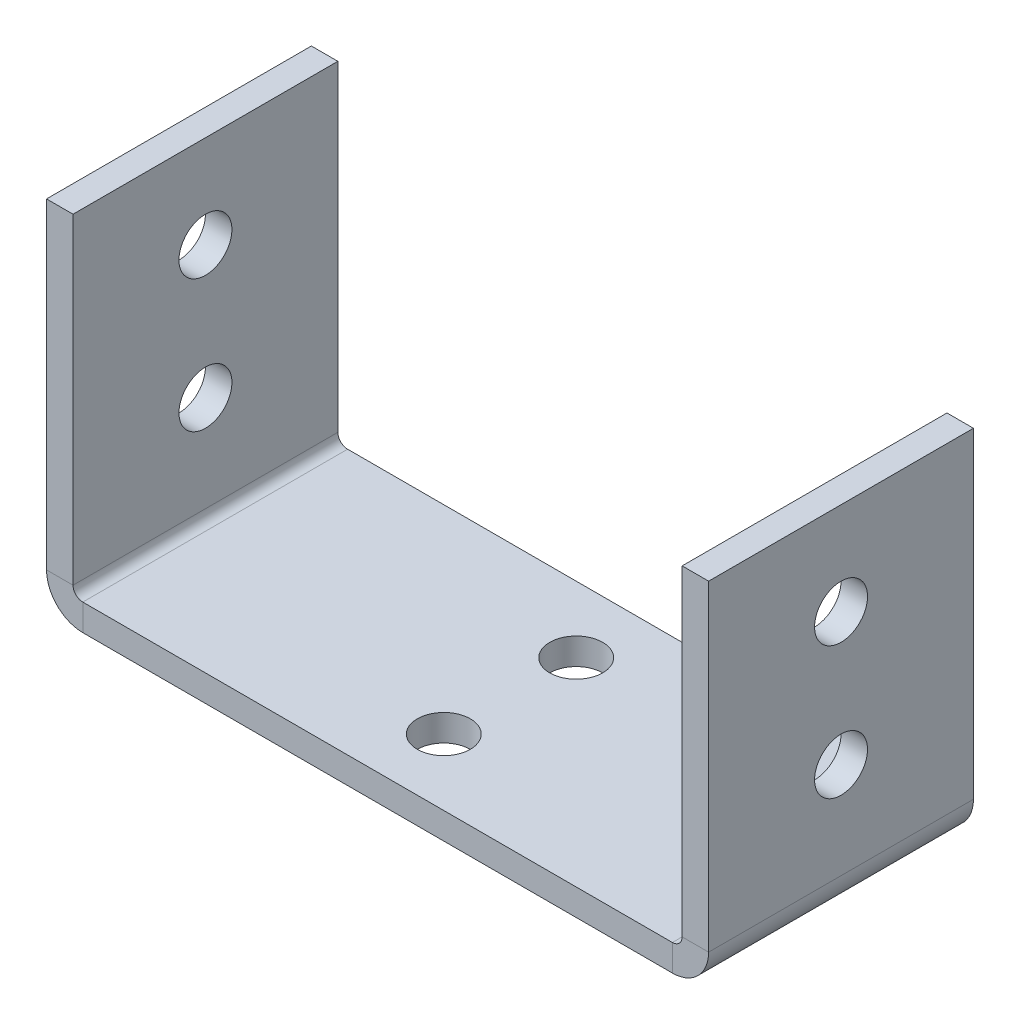
ISO-10303-21;
HEADER;
FILE_DESCRIPTION(('STEP AP214'),'2;1');
FILE_NAME('part.step','',(''),(''),'','','');
FILE_SCHEMA(('AUTOMOTIVE_DESIGN { 1 0 10303 214 1 1 1 1 }'));
ENDSEC;
DATA;
#1=APPLICATION_CONTEXT('core data for automotive mechanical design processes');
#2=APPLICATION_PROTOCOL_DEFINITION('international standard','automotive_design',2000,#1);
#3=PRODUCT_CONTEXT('',#1,'mechanical');
#4=PRODUCT('Part','Part','',(#3));
#5=PRODUCT_RELATED_PRODUCT_CATEGORY('part','',(#4));
#6=PRODUCT_DEFINITION_FORMATION('','',#4);
#7=PRODUCT_DEFINITION_CONTEXT('part definition',#1,'design');
#8=PRODUCT_DEFINITION('design','',#6,#7);
#9=PRODUCT_DEFINITION_SHAPE('','',#8);
#10=(LENGTH_UNIT() NAMED_UNIT(*) SI_UNIT(.MILLI.,.METRE.));
#11=(NAMED_UNIT(*) PLANE_ANGLE_UNIT() SI_UNIT($,.RADIAN.));
#12=(NAMED_UNIT(*) SI_UNIT($,.STERADIAN.) SOLID_ANGLE_UNIT());
#13=UNCERTAINTY_MEASURE_WITH_UNIT(LENGTH_MEASURE(1.E-05),#10,'distance_accuracy_value','');
#14=(GEOMETRIC_REPRESENTATION_CONTEXT(3) GLOBAL_UNCERTAINTY_ASSIGNED_CONTEXT((#13)) GLOBAL_UNIT_ASSIGNED_CONTEXT((#10,
#11,#12)) REPRESENTATION_CONTEXT('',''));
#15=CARTESIAN_POINT('',(0.,0.,0.));
#16=DIRECTION('',(0.,0.,1.));
#17=DIRECTION('',(1.,0.,0.));
#18=AXIS2_PLACEMENT_3D('',#15,#16,#17);
#19=CARTESIAN_POINT('',(0.,-2.,0.));
#20=DIRECTION('',(0.,1.,0.));
#21=DIRECTION('',(0.,0.,1.));
#22=AXIS2_PLACEMENT_3D('',#19,#20,#21);
#23=PLANE('',#22);
#24=CARTESIAN_POINT('',(25.,-2.,-5.));
#25=DIRECTION('',(0.,-1.,0.));
#26=DIRECTION('',(0.,0.,-1.));
#27=AXIS2_PLACEMENT_3D('',#24,#25,#26);
#28=CIRCLE('',#27,2.);
#29=CARTESIAN_POINT('',(25.,-2.,-7.));
#30=VERTEX_POINT('',#29);
#31=EDGE_CURVE('E367',#30,#30,#28,.T.);
#32=ORIENTED_EDGE('',*,*,#31,.F.);
#33=EDGE_LOOP('',(#32));
#34=FACE_BOUND('',#33,.T.);
#35=CARTESIAN_POINT('',(25.,-2.,-15.));
#36=DIRECTION('',(0.,-1.,0.));
#37=DIRECTION('',(0.,0.,-1.));
#38=AXIS2_PLACEMENT_3D('',#35,#36,#37);
#39=CIRCLE('',#38,2.);
#40=CARTESIAN_POINT('',(25.,-2.,-17.));
#41=VERTEX_POINT('',#40);
#42=EDGE_CURVE('E366',#41,#41,#39,.T.);
#43=ORIENTED_EDGE('',*,*,#42,.F.);
#44=EDGE_LOOP('',(#43));
#45=FACE_BOUND('',#44,.T.);
#46=DIRECTION('',(0.,0.,1.));
#47=VECTOR('',#46,1.);
#48=CARTESIAN_POINT('',(2.7366,-2.,0.));
#49=LINE('',#48,#47);
#50=CARTESIAN_POINT('',(2.7366,-2.,0.));
#51=VERTEX_POINT('',#50);
#52=CARTESIAN_POINT('',(2.7366,-2.,-20.));
#53=VERTEX_POINT('',#52);
#54=EDGE_CURVE('E226',#51,#53,#49,.F.);
#55=ORIENTED_EDGE('',*,*,#54,.T.);
#56=DIRECTION('',(-1.,0.,0.));
#57=VECTOR('',#56,1.);
#58=CARTESIAN_POINT('',(0.,-2.,-20.));
#59=LINE('',#58,#57);
#60=CARTESIAN_POINT('',(47.2634,-2.,-20.));
#61=VERTEX_POINT('',#60);
#62=EDGE_CURVE('E13',#61,#53,#59,.T.);
#63=ORIENTED_EDGE('',*,*,#62,.F.);
#64=DIRECTION('',(0.,0.,-1.));
#65=VECTOR('',#64,1.);
#66=CARTESIAN_POINT('',(47.2634,-2.,-20.));
#67=LINE('',#66,#65);
#68=CARTESIAN_POINT('',(47.2634,-2.,0.));
#69=VERTEX_POINT('',#68);
#70=EDGE_CURVE('E299',#61,#69,#67,.F.);
#71=ORIENTED_EDGE('',*,*,#70,.T.);
#72=DIRECTION('',(1.,0.,0.));
#73=VECTOR('',#72,1.);
#74=CARTESIAN_POINT('',(0.,-2.,0.));
#75=LINE('',#74,#73);
#76=EDGE_CURVE('E90',#51,#69,#75,.T.);
#77=ORIENTED_EDGE('',*,*,#76,.F.);
#78=EDGE_LOOP('',(#55,#63,#71,#77));
#79=FACE_BOUND('',#78,.T.);
#80=ADVANCED_FACE('F80',(#34,#45,#79),#23,.F.);
#81=CARTESIAN_POINT('',(0.,0.,0.));
#82=DIRECTION('',(0.,1.,0.));
#83=DIRECTION('',(0.,0.,1.));
#84=AXIS2_PLACEMENT_3D('',#81,#82,#83);
#85=PLANE('',#84);
#86=CARTESIAN_POINT('',(25.,0.,-5.));
#87=DIRECTION('',(0.,1.,0.));
#88=DIRECTION('',(0.,0.,1.));
#89=AXIS2_PLACEMENT_3D('',#86,#87,#88);
#90=CIRCLE('',#89,2.);
#91=CARTESIAN_POINT('',(25.,0.,-7.));
#92=VERTEX_POINT('',#91);
#93=EDGE_CURVE('E225',#92,#92,#90,.F.);
#94=ORIENTED_EDGE('',*,*,#93,.T.);
#95=EDGE_LOOP('',(#94));
#96=FACE_BOUND('',#95,.T.);
#97=CARTESIAN_POINT('',(25.,0.,-15.));
#98=DIRECTION('',(0.,1.,0.));
#99=DIRECTION('',(0.,0.,1.));
#100=AXIS2_PLACEMENT_3D('',#97,#98,#99);
#101=CIRCLE('',#100,2.);
#102=CARTESIAN_POINT('',(25.,0.,-17.));
#103=VERTEX_POINT('',#102);
#104=EDGE_CURVE('E371',#103,#103,#101,.F.);
#105=ORIENTED_EDGE('',*,*,#104,.T.);
#106=EDGE_LOOP('',(#105));
#107=FACE_BOUND('',#106,.T.);
#108=DIRECTION('',(-1.,0.,0.));
#109=VECTOR('',#108,1.);
#110=CARTESIAN_POINT('',(0.,0.,-20.));
#111=LINE('',#110,#109);
#112=CARTESIAN_POINT('',(47.2634,0.,-20.));
#113=VERTEX_POINT('',#112);
#114=CARTESIAN_POINT('',(2.7366,0.,-20.));
#115=VERTEX_POINT('',#114);
#116=EDGE_CURVE('E329',#113,#115,#111,.T.);
#117=ORIENTED_EDGE('',*,*,#116,.T.);
#118=DIRECTION('',(0.,0.,1.));
#119=VECTOR('',#118,1.);
#120=CARTESIAN_POINT('',(2.7366,0.,0.));
#121=LINE('',#120,#119);
#122=CARTESIAN_POINT('',(2.7366,0.,0.));
#123=VERTEX_POINT('',#122);
#124=EDGE_CURVE('E242',#123,#115,#121,.F.);
#125=ORIENTED_EDGE('',*,*,#124,.F.);
#126=DIRECTION('',(1.,0.,0.));
#127=VECTOR('',#126,1.);
#128=CARTESIAN_POINT('',(0.,0.,0.));
#129=LINE('',#128,#127);
#130=CARTESIAN_POINT('',(47.2634,0.,0.));
#131=VERTEX_POINT('',#130);
#132=EDGE_CURVE('E324',#123,#131,#129,.T.);
#133=ORIENTED_EDGE('',*,*,#132,.T.);
#134=DIRECTION('',(0.,0.,-1.));
#135=VECTOR('',#134,1.);
#136=CARTESIAN_POINT('',(47.2634,0.,-20.));
#137=LINE('',#136,#135);
#138=EDGE_CURVE('E98',#113,#131,#137,.F.);
#139=ORIENTED_EDGE('',*,*,#138,.F.);
#140=EDGE_LOOP('',(#117,#125,#133,#139));
#141=FACE_BOUND('',#140,.T.);
#142=ADVANCED_FACE('F408',(#96,#107,#141),#85,.T.);
#143=CARTESIAN_POINT('',(0.,-2.,0.));
#144=DIRECTION('',(0.,0.,1.));
#145=DIRECTION('',(1.,0.,0.));
#146=AXIS2_PLACEMENT_3D('',#143,#144,#145);
#147=PLANE('',#146);
#148=ORIENTED_EDGE('',*,*,#132,.F.);
#149=DIRECTION('',(0.,-1.,0.));
#150=VECTOR('',#149,1.);
#151=CARTESIAN_POINT('',(2.7366,0.,0.));
#152=LINE('',#151,#150);
#153=EDGE_CURVE('E234',#123,#51,#152,.T.);
#154=ORIENTED_EDGE('',*,*,#153,.T.);
#155=ORIENTED_EDGE('',*,*,#76,.T.);
#156=DIRECTION('',(0.,-1.,0.));
#157=VECTOR('',#156,1.);
#158=CARTESIAN_POINT('',(47.2634,0.,0.));
#159=LINE('',#158,#157);
#160=EDGE_CURVE('E320',#131,#69,#159,.T.);
#161=ORIENTED_EDGE('',*,*,#160,.F.);
#162=EDGE_LOOP('',(#148,#154,#155,#161));
#163=FACE_BOUND('',#162,.T.);
#164=ADVANCED_FACE('F82',(#163),#147,.T.);
#165=CARTESIAN_POINT('',(0.,-2.,-20.));
#166=DIRECTION('',(0.,0.,-1.));
#167=DIRECTION('',(-1.,0.,0.));
#168=AXIS2_PLACEMENT_3D('',#165,#166,#167);
#169=PLANE('',#168);
#170=DIRECTION('',(0.,-1.,0.));
#171=VECTOR('',#170,1.);
#172=CARTESIAN_POINT('',(2.7366,0.,-20.));
#173=LINE('',#172,#171);
#174=EDGE_CURVE('E250',#115,#53,#173,.T.);
#175=ORIENTED_EDGE('',*,*,#174,.F.);
#176=ORIENTED_EDGE('',*,*,#116,.F.);
#177=DIRECTION('',(0.,-1.,0.));
#178=VECTOR('',#177,1.);
#179=CARTESIAN_POINT('',(47.2634,0.,-20.));
#180=LINE('',#179,#178);
#181=EDGE_CURVE('E307',#113,#61,#180,.T.);
#182=ORIENTED_EDGE('',*,*,#181,.T.);
#183=ORIENTED_EDGE('',*,*,#62,.T.);
#184=EDGE_LOOP('',(#175,#176,#182,#183));
#185=FACE_BOUND('',#184,.T.);
#186=ADVANCED_FACE('F421',(#185),#169,.T.);
#187=CARTESIAN_POINT('',(47.2634,0.7366,0.));
#188=DIRECTION('',(0.,0.,1.));
#189=DIRECTION('',(1.,0.,0.));
#190=AXIS2_PLACEMENT_3D('',#187,#188,#189);
#191=PLANE('',#190);
#192=DIRECTION('',(-1.,0.,0.));
#193=VECTOR('',#192,1.);
#194=CARTESIAN_POINT('',(50.,0.73659999999999,0.));
#195=LINE('',#194,#193);
#196=CARTESIAN_POINT('',(48.,0.736599999999997,0.));
#197=VERTEX_POINT('',#196);
#198=CARTESIAN_POINT('',(50.,0.73659999999999,0.));
#199=VERTEX_POINT('',#198);
#200=EDGE_CURVE('E254',#197,#199,#195,.F.);
#201=ORIENTED_EDGE('',*,*,#200,.F.);
#202=CARTESIAN_POINT('',(47.2634,0.7366,0.));
#203=DIRECTION('',(0.,0.,-1.));
#204=DIRECTION('',(-1.,0.,0.));
#205=AXIS2_PLACEMENT_3D('',#202,#203,#204);
#206=CIRCLE('',#205,0.736599999999997);
#207=EDGE_CURVE('E311',#131,#197,#206,.F.);
#208=ORIENTED_EDGE('',*,*,#207,.F.);
#209=ORIENTED_EDGE('',*,*,#160,.T.);
#210=CARTESIAN_POINT('',(47.2634,0.7366,0.));
#211=DIRECTION('',(0.,0.,-1.));
#212=DIRECTION('',(-1.,0.,0.));
#213=AXIS2_PLACEMENT_3D('',#210,#211,#212);
#214=CIRCLE('',#213,2.7366);
#215=EDGE_CURVE('E302',#69,#199,#214,.F.);
#216=ORIENTED_EDGE('',*,*,#215,.T.);
#217=EDGE_LOOP('',(#201,#208,#209,#216));
#218=FACE_BOUND('',#217,.T.);
#219=ADVANCED_FACE('F423',(#218),#191,.T.);
#220=CARTESIAN_POINT('',(47.2634,0.7366,-20.));
#221=DIRECTION('',(0.,0.,1.));
#222=DIRECTION('',(1.,0.,0.));
#223=AXIS2_PLACEMENT_3D('',#220,#221,#222);
#224=PLANE('',#223);
#225=CARTESIAN_POINT('',(47.2634,0.7366,-20.));
#226=DIRECTION('',(0.,0.,-1.));
#227=DIRECTION('',(-1.,0.,0.));
#228=AXIS2_PLACEMENT_3D('',#225,#226,#227);
#229=CIRCLE('',#228,0.736599999999997);
#230=CARTESIAN_POINT('',(48.,0.736599999999997,-20.));
#231=VERTEX_POINT('',#230);
#232=EDGE_CURVE('E261',#231,#113,#229,.T.);
#233=ORIENTED_EDGE('',*,*,#232,.F.);
#234=DIRECTION('',(-1.,0.,0.));
#235=VECTOR('',#234,1.);
#236=CARTESIAN_POINT('',(48.,0.736599999999997,-20.));
#237=LINE('',#236,#235);
#238=CARTESIAN_POINT('',(50.,0.73659999999999,-20.));
#239=VERTEX_POINT('',#238);
#240=EDGE_CURVE('E289',#231,#239,#237,.F.);
#241=ORIENTED_EDGE('',*,*,#240,.T.);
#242=CARTESIAN_POINT('',(47.2634,0.7366,-20.));
#243=DIRECTION('',(0.,0.,-1.));
#244=DIRECTION('',(-1.,0.,0.));
#245=AXIS2_PLACEMENT_3D('',#242,#243,#244);
#246=CIRCLE('',#245,2.7366);
#247=EDGE_CURVE('E303',#239,#61,#246,.T.);
#248=ORIENTED_EDGE('',*,*,#247,.T.);
#249=ORIENTED_EDGE('',*,*,#181,.F.);
#250=EDGE_LOOP('',(#233,#241,#248,#249));
#251=FACE_BOUND('',#250,.T.);
#252=ADVANCED_FACE('F419',(#251),#224,.F.);
#253=CARTESIAN_POINT('',(47.2634,0.7366,-20.));
#254=DIRECTION('',(0.,0.,-1.));
#255=DIRECTION('',(1.,0.,0.));
#256=AXIS2_PLACEMENT_3D('',#253,#254,#255);
#257=CYLINDRICAL_SURFACE('',#256,2.7366);
#258=ORIENTED_EDGE('',*,*,#70,.F.);
#259=ORIENTED_EDGE('',*,*,#247,.F.);
#260=DIRECTION('',(0.,0.,-1.));
#261=VECTOR('',#260,1.);
#262=CARTESIAN_POINT('',(50.,0.73659999999999,0.));
#263=LINE('',#262,#261);
#264=EDGE_CURVE('E286',#239,#199,#263,.F.);
#265=ORIENTED_EDGE('',*,*,#264,.T.);
#266=ORIENTED_EDGE('',*,*,#215,.F.);
#267=EDGE_LOOP('',(#258,#259,#265,#266));
#268=FACE_BOUND('',#267,.T.);
#269=ADVANCED_FACE('F474',(#268),#257,.T.);
#270=CARTESIAN_POINT('',(47.2634,0.7366,-20.));
#271=DIRECTION('',(0.,0.,-1.));
#272=DIRECTION('',(1.,0.,0.));
#273=AXIS2_PLACEMENT_3D('',#270,#271,#272);
#274=CYLINDRICAL_SURFACE('',#273,0.736599999999997);
#275=ORIENTED_EDGE('',*,*,#138,.T.);
#276=ORIENTED_EDGE('',*,*,#207,.T.);
#277=DIRECTION('',(0.,0.,-1.));
#278=VECTOR('',#277,1.);
#279=CARTESIAN_POINT('',(48.,0.736599999999997,0.));
#280=LINE('',#279,#278);
#281=EDGE_CURVE('E293',#197,#231,#280,.T.);
#282=ORIENTED_EDGE('',*,*,#281,.T.);
#283=ORIENTED_EDGE('',*,*,#232,.T.);
#284=EDGE_LOOP('',(#275,#276,#282,#283));
#285=FACE_BOUND('',#284,.T.);
#286=ADVANCED_FACE('F443',(#285),#274,.F.);
#287=CARTESIAN_POINT('',(50.0000000000001,25.,-20.));
#288=DIRECTION('',(0.,0.,1.));
#289=DIRECTION('',(0.,-1.,0.));
#290=AXIS2_PLACEMENT_3D('',#287,#288,#289);
#291=PLANE('',#290);
#292=ORIENTED_EDGE('',*,*,#240,.F.);
#293=DIRECTION('',(0.,-1.,0.));
#294=VECTOR('',#293,1.);
#295=CARTESIAN_POINT('',(48.0000000000001,25.,-20.));
#296=LINE('',#295,#294);
#297=CARTESIAN_POINT('',(48.0000000000001,25.,-20.));
#298=VERTEX_POINT('',#297);
#299=EDGE_CURVE('E283',#231,#298,#296,.F.);
#300=ORIENTED_EDGE('',*,*,#299,.T.);
#301=DIRECTION('',(-1.,0.,0.));
#302=VECTOR('',#301,1.);
#303=CARTESIAN_POINT('',(50.0000000000001,25.,-20.));
#304=LINE('',#303,#302);
#305=CARTESIAN_POINT('',(50.0000000000001,25.,-20.));
#306=VERTEX_POINT('',#305);
#307=EDGE_CURVE('E257',#306,#298,#304,.T.);
#308=ORIENTED_EDGE('',*,*,#307,.F.);
#309=DIRECTION('',(0.,1.,0.));
#310=VECTOR('',#309,1.);
#311=CARTESIAN_POINT('',(50.,-1.84618646617711E-13,-20.));
#312=LINE('',#311,#310);
#313=EDGE_CURVE('E273',#239,#306,#312,.T.);
#314=ORIENTED_EDGE('',*,*,#313,.F.);
#315=EDGE_LOOP('',(#292,#300,#308,#314));
#316=FACE_BOUND('',#315,.T.);
#317=ADVANCED_FACE('F466',(#316),#291,.F.);
#318=CARTESIAN_POINT('',(50.,0.,0.));
#319=DIRECTION('',(0.,0.,-1.));
#320=DIRECTION('',(-1.,0.,0.));
#321=AXIS2_PLACEMENT_3D('',#318,#319,#320);
#322=PLANE('',#321);
#323=ORIENTED_EDGE('',*,*,#200,.T.);
#324=DIRECTION('',(0.,-1.,0.));
#325=VECTOR('',#324,1.);
#326=CARTESIAN_POINT('',(50.,-1.87394204179274E-13,0.));
#327=LINE('',#326,#325);
#328=CARTESIAN_POINT('',(50.0000000000001,25.,0.));
#329=VERTEX_POINT('',#328);
#330=EDGE_CURVE('E266',#329,#199,#327,.T.);
#331=ORIENTED_EDGE('',*,*,#330,.F.);
#332=DIRECTION('',(-1.,0.,0.));
#333=VECTOR('',#332,1.);
#334=CARTESIAN_POINT('',(50.0000000000001,25.,0.));
#335=LINE('',#334,#333);
#336=CARTESIAN_POINT('',(48.0000000000001,25.,0.));
#337=VERTEX_POINT('',#336);
#338=EDGE_CURVE('E262',#329,#337,#335,.T.);
#339=ORIENTED_EDGE('',*,*,#338,.T.);
#340=DIRECTION('',(0.,1.,0.));
#341=VECTOR('',#340,1.);
#342=CARTESIAN_POINT('',(48.,0.,0.));
#343=LINE('',#342,#341);
#344=EDGE_CURVE('E276',#337,#197,#343,.F.);
#345=ORIENTED_EDGE('',*,*,#344,.T.);
#346=EDGE_LOOP('',(#323,#331,#339,#345));
#347=FACE_BOUND('',#346,.T.);
#348=ADVANCED_FACE('F448',(#347),#322,.F.);
#349=CARTESIAN_POINT('',(50.,-1.87394204179274E-13,0.));
#350=DIRECTION('',(-1.,0.,0.));
#351=DIRECTION('',(0.,-1.,0.));
#352=AXIS2_PLACEMENT_3D('',#349,#350,#351);
#353=PLANE('',#352);
#354=CARTESIAN_POINT('',(50.,7.99999999999999,-10.));
#355=DIRECTION('',(1.,0.,0.));
#356=DIRECTION('',(0.,1.,0.));
#357=AXIS2_PLACEMENT_3D('',#354,#355,#356);
#358=CIRCLE('',#357,2.);
#359=CARTESIAN_POINT('',(50.,9.99999999999999,-10.));
#360=VERTEX_POINT('',#359);
#361=EDGE_CURVE('E346',#360,#360,#358,.T.);
#362=ORIENTED_EDGE('',*,*,#361,.F.);
#363=EDGE_LOOP('',(#362));
#364=FACE_BOUND('',#363,.T.);
#365=CARTESIAN_POINT('',(50.0000000000001,18.,-10.));
#366=DIRECTION('',(1.,0.,0.));
#367=DIRECTION('',(0.,1.,0.));
#368=AXIS2_PLACEMENT_3D('',#365,#366,#367);
#369=CIRCLE('',#368,2.);
#370=CARTESIAN_POINT('',(50.0000000000001,20.,-10.));
#371=VERTEX_POINT('',#370);
#372=EDGE_CURVE('E355',#371,#371,#369,.T.);
#373=ORIENTED_EDGE('',*,*,#372,.F.);
#374=EDGE_LOOP('',(#373));
#375=FACE_BOUND('',#374,.T.);
#376=ORIENTED_EDGE('',*,*,#264,.F.);
#377=ORIENTED_EDGE('',*,*,#313,.T.);
#378=DIRECTION('',(0.,0.,1.));
#379=VECTOR('',#378,1.);
#380=CARTESIAN_POINT('',(50.0000000000001,25.,0.));
#381=LINE('',#380,#379);
#382=EDGE_CURVE('E270',#306,#329,#381,.T.);
#383=ORIENTED_EDGE('',*,*,#382,.T.);
#384=ORIENTED_EDGE('',*,*,#330,.T.);
#385=EDGE_LOOP('',(#376,#377,#383,#384));
#386=FACE_BOUND('',#385,.T.);
#387=ADVANCED_FACE('F452',(#364,#375,#386),#353,.F.);
#388=CARTESIAN_POINT('',(48.,-1.80411241501588E-13,0.));
#389=DIRECTION('',(-1.,0.,0.));
#390=DIRECTION('',(0.,-1.,0.));
#391=AXIS2_PLACEMENT_3D('',#388,#389,#390);
#392=PLANE('',#391);
#393=CARTESIAN_POINT('',(48.,8.,-10.));
#394=DIRECTION('',(-1.,0.,0.));
#395=DIRECTION('',(0.,-1.,0.));
#396=AXIS2_PLACEMENT_3D('',#393,#394,#395);
#397=CIRCLE('',#396,2.);
#398=CARTESIAN_POINT('',(48.,6.,-10.));
#399=VERTEX_POINT('',#398);
#400=EDGE_CURVE('E362',#399,#399,#397,.T.);
#401=ORIENTED_EDGE('',*,*,#400,.F.);
#402=EDGE_LOOP('',(#401));
#403=FACE_BOUND('',#402,.T.);
#404=CARTESIAN_POINT('',(48.0000000000001,18.,-10.));
#405=DIRECTION('',(-1.,0.,0.));
#406=DIRECTION('',(0.,-1.,0.));
#407=AXIS2_PLACEMENT_3D('',#404,#405,#406);
#408=CIRCLE('',#407,2.);
#409=CARTESIAN_POINT('',(48.0000000000001,16.,-10.));
#410=VERTEX_POINT('',#409);
#411=EDGE_CURVE('E337',#410,#410,#408,.T.);
#412=ORIENTED_EDGE('',*,*,#411,.F.);
#413=EDGE_LOOP('',(#412));
#414=FACE_BOUND('',#413,.T.);
#415=ORIENTED_EDGE('',*,*,#299,.F.);
#416=ORIENTED_EDGE('',*,*,#281,.F.);
#417=ORIENTED_EDGE('',*,*,#344,.F.);
#418=DIRECTION('',(0.,0.,-1.));
#419=VECTOR('',#418,1.);
#420=CARTESIAN_POINT('',(48.0000000000001,25.,0.));
#421=LINE('',#420,#419);
#422=EDGE_CURVE('E280',#298,#337,#421,.F.);
#423=ORIENTED_EDGE('',*,*,#422,.F.);
#424=EDGE_LOOP('',(#415,#416,#417,#423));
#425=FACE_BOUND('',#424,.T.);
#426=ADVANCED_FACE('F462',(#403,#414,#425),#392,.T.);
#427=CARTESIAN_POINT('',(50.0000000000001,25.,0.));
#428=DIRECTION('',(0.,-1.,0.));
#429=DIRECTION('',(1.,0.,0.));
#430=AXIS2_PLACEMENT_3D('',#427,#428,#429);
#431=PLANE('',#430);
#432=ORIENTED_EDGE('',*,*,#422,.T.);
#433=ORIENTED_EDGE('',*,*,#338,.F.);
#434=ORIENTED_EDGE('',*,*,#382,.F.);
#435=ORIENTED_EDGE('',*,*,#307,.T.);
#436=EDGE_LOOP('',(#432,#433,#434,#435));
#437=FACE_BOUND('',#436,.T.);
#438=ADVANCED_FACE('F458',(#437),#431,.F.);
#439=CARTESIAN_POINT('',(2.7366,0.7366,-20.));
#440=DIRECTION('',(0.,0.,-1.));
#441=DIRECTION('',(-1.,0.,0.));
#442=AXIS2_PLACEMENT_3D('',#439,#440,#441);
#443=PLANE('',#442);
#444=DIRECTION('',(1.,0.,0.));
#445=VECTOR('',#444,1.);
#446=CARTESIAN_POINT('',(0.,0.73659999999999,-20.));
#447=LINE('',#446,#445);
#448=CARTESIAN_POINT('',(2.,0.736599999999997,-20.));
#449=VERTEX_POINT('',#448);
#450=CARTESIAN_POINT('',(0.,0.73659999999999,-20.));
#451=VERTEX_POINT('',#450);
#452=EDGE_CURVE('E199',#449,#451,#447,.F.);
#453=ORIENTED_EDGE('',*,*,#452,.F.);
#454=CARTESIAN_POINT('',(2.7366,0.7366,-20.));
#455=DIRECTION('',(0.,0.,1.));
#456=DIRECTION('',(1.,0.,0.));
#457=AXIS2_PLACEMENT_3D('',#454,#455,#456);
#458=CIRCLE('',#457,0.7366);
#459=EDGE_CURVE('E238',#115,#449,#458,.F.);
#460=ORIENTED_EDGE('',*,*,#459,.F.);
#461=ORIENTED_EDGE('',*,*,#174,.T.);
#462=CARTESIAN_POINT('',(2.7366,0.7366,-20.));
#463=DIRECTION('',(0.,0.,1.));
#464=DIRECTION('',(1.,0.,0.));
#465=AXIS2_PLACEMENT_3D('',#462,#463,#464);
#466=CIRCLE('',#465,2.7366);
#467=EDGE_CURVE('E229',#53,#451,#466,.F.);
#468=ORIENTED_EDGE('',*,*,#467,.T.);
#469=EDGE_LOOP('',(#453,#460,#461,#468));
#470=FACE_BOUND('',#469,.T.);
#471=ADVANCED_FACE('F434',(#470),#443,.T.);
#472=CARTESIAN_POINT('',(2.7366,0.7366,0.));
#473=DIRECTION('',(0.,0.,-1.));
#474=DIRECTION('',(-1.,0.,0.));
#475=AXIS2_PLACEMENT_3D('',#472,#473,#474);
#476=PLANE('',#475);
#477=CARTESIAN_POINT('',(2.7366,0.7366,0.));
#478=DIRECTION('',(0.,0.,1.));
#479=DIRECTION('',(1.,0.,0.));
#480=AXIS2_PLACEMENT_3D('',#477,#478,#479);
#481=CIRCLE('',#480,0.7366);
#482=CARTESIAN_POINT('',(2.,0.736599999999997,0.));
#483=VERTEX_POINT('',#482);
#484=EDGE_CURVE('E246',#483,#123,#481,.T.);
#485=ORIENTED_EDGE('',*,*,#484,.F.);
#486=DIRECTION('',(1.,0.,0.));
#487=VECTOR('',#486,1.);
#488=CARTESIAN_POINT('',(2.,0.736599999999997,0.));
#489=LINE('',#488,#487);
#490=CARTESIAN_POINT('',(0.,0.73659999999999,0.));
#491=VERTEX_POINT('',#490);
#492=EDGE_CURVE('E216',#483,#491,#489,.F.);
#493=ORIENTED_EDGE('',*,*,#492,.T.);
#494=CARTESIAN_POINT('',(2.7366,0.7366,0.));
#495=DIRECTION('',(0.,0.,1.));
#496=DIRECTION('',(1.,0.,0.));
#497=AXIS2_PLACEMENT_3D('',#494,#495,#496);
#498=CIRCLE('',#497,2.7366);
#499=EDGE_CURVE('E230',#491,#51,#498,.T.);
#500=ORIENTED_EDGE('',*,*,#499,.T.);
#501=ORIENTED_EDGE('',*,*,#153,.F.);
#502=EDGE_LOOP('',(#485,#493,#500,#501));
#503=FACE_BOUND('',#502,.T.);
#504=ADVANCED_FACE('F394',(#503),#476,.F.);
#505=CARTESIAN_POINT('',(2.7366,0.7366,0.));
#506=DIRECTION('',(0.,0.,1.));
#507=DIRECTION('',(-1.,0.,0.));
#508=AXIS2_PLACEMENT_3D('',#505,#506,#507);
#509=CYLINDRICAL_SURFACE('',#508,2.7366);
#510=ORIENTED_EDGE('',*,*,#54,.F.);
#511=ORIENTED_EDGE('',*,*,#499,.F.);
#512=DIRECTION('',(0.,0.,1.));
#513=VECTOR('',#512,1.);
#514=CARTESIAN_POINT('',(0.,0.73659999999999,-20.));
#515=LINE('',#514,#513);
#516=EDGE_CURVE('E213',#491,#451,#515,.F.);
#517=ORIENTED_EDGE('',*,*,#516,.T.);
#518=ORIENTED_EDGE('',*,*,#467,.F.);
#519=EDGE_LOOP('',(#510,#511,#517,#518));
#520=FACE_BOUND('',#519,.T.);
#521=ADVANCED_FACE('F437',(#520),#509,.T.);
#522=CARTESIAN_POINT('',(2.7366,0.7366,0.));
#523=DIRECTION('',(0.,0.,1.));
#524=DIRECTION('',(-1.,0.,0.));
#525=AXIS2_PLACEMENT_3D('',#522,#523,#524);
#526=CYLINDRICAL_SURFACE('',#525,0.7366);
#527=ORIENTED_EDGE('',*,*,#124,.T.);
#528=ORIENTED_EDGE('',*,*,#459,.T.);
#529=DIRECTION('',(0.,0.,1.));
#530=VECTOR('',#529,1.);
#531=CARTESIAN_POINT('',(2.,0.736599999999997,-20.));
#532=LINE('',#531,#530);
#533=EDGE_CURVE('E220',#449,#483,#532,.T.);
#534=ORIENTED_EDGE('',*,*,#533,.T.);
#535=ORIENTED_EDGE('',*,*,#484,.T.);
#536=EDGE_LOOP('',(#527,#528,#534,#535));
#537=FACE_BOUND('',#536,.T.);
#538=ADVANCED_FACE('F389',(#537),#526,.F.);
#539=CARTESIAN_POINT('',(0.,0.,-20.));
#540=DIRECTION('',(0.,0.,1.));
#541=DIRECTION('',(1.,0.,0.));
#542=AXIS2_PLACEMENT_3D('',#539,#540,#541);
#543=PLANE('',#542);
#544=ORIENTED_EDGE('',*,*,#452,.T.);
#545=DIRECTION('',(0.,-1.,0.));
#546=VECTOR('',#545,1.);
#547=CARTESIAN_POINT('',(0.,0.,-20.));
#548=LINE('',#547,#546);
#549=CARTESIAN_POINT('',(0.,25.,-20.));
#550=VERTEX_POINT('',#549);
#551=EDGE_CURVE('E178',#550,#451,#548,.T.);
#552=ORIENTED_EDGE('',*,*,#551,.F.);
#553=DIRECTION('',(1.,0.,0.));
#554=VECTOR('',#553,1.);
#555=CARTESIAN_POINT('',(0.,25.,-20.));
#556=LINE('',#555,#554);
#557=CARTESIAN_POINT('',(1.99999999999991,25.,-20.));
#558=VERTEX_POINT('',#557);
#559=EDGE_CURVE('E185',#550,#558,#556,.T.);
#560=ORIENTED_EDGE('',*,*,#559,.T.);
#561=DIRECTION('',(0.,1.,0.));
#562=VECTOR('',#561,1.);
#563=CARTESIAN_POINT('',(2.,0.,-20.));
#564=LINE('',#563,#562);
#565=EDGE_CURVE('E210',#558,#449,#564,.F.);
#566=ORIENTED_EDGE('',*,*,#565,.T.);
#567=EDGE_LOOP('',(#544,#552,#560,#566));
#568=FACE_BOUND('',#567,.T.);
#569=ADVANCED_FACE('F198',(#568),#543,.F.);
#570=CARTESIAN_POINT('',(0.,25.,0.));
#571=DIRECTION('',(0.,0.,-1.));
#572=DIRECTION('',(-1.,0.,0.));
#573=AXIS2_PLACEMENT_3D('',#570,#571,#572);
#574=PLANE('',#573);
#575=ORIENTED_EDGE('',*,*,#492,.F.);
#576=DIRECTION('',(0.,-1.,0.));
#577=VECTOR('',#576,1.);
#578=CARTESIAN_POINT('',(1.99999999999991,25.,0.));
#579=LINE('',#578,#577);
#580=CARTESIAN_POINT('',(1.99999999999991,25.,0.));
#581=VERTEX_POINT('',#580);
#582=EDGE_CURVE('E205',#483,#581,#579,.F.);
#583=ORIENTED_EDGE('',*,*,#582,.T.);
#584=DIRECTION('',(1.,0.,0.));
#585=VECTOR('',#584,1.);
#586=CARTESIAN_POINT('',(0.,25.,0.));
#587=LINE('',#586,#585);
#588=CARTESIAN_POINT('',(0.,25.,0.));
#589=VERTEX_POINT('',#588);
#590=EDGE_CURVE('E195',#589,#581,#587,.T.);
#591=ORIENTED_EDGE('',*,*,#590,.F.);
#592=DIRECTION('',(0.,1.,0.));
#593=VECTOR('',#592,1.);
#594=CARTESIAN_POINT('',(0.,0.,0.));
#595=LINE('',#594,#593);
#596=EDGE_CURVE('E180',#491,#589,#595,.T.);
#597=ORIENTED_EDGE('',*,*,#596,.F.);
#598=EDGE_LOOP('',(#575,#583,#591,#597));
#599=FACE_BOUND('',#598,.T.);
#600=ADVANCED_FACE('F395',(#599),#574,.F.);
#601=CARTESIAN_POINT('',(0.,0.,0.));
#602=DIRECTION('',(1.,0.,0.));
#603=DIRECTION('',(0.,1.,0.));
#604=AXIS2_PLACEMENT_3D('',#601,#602,#603);
#605=PLANE('',#604);
#606=CARTESIAN_POINT('',(0.,8.00000000000017,-10.));
#607=DIRECTION('',(1.,0.,0.));
#608=DIRECTION('',(0.,1.,0.));
#609=AXIS2_PLACEMENT_3D('',#606,#607,#608);
#610=CIRCLE('',#609,2.);
#611=CARTESIAN_POINT('',(0.,10.0000000000002,-10.));
#612=VERTEX_POINT('',#611);
#613=EDGE_CURVE('E338',#612,#612,#610,.F.);
#614=ORIENTED_EDGE('',*,*,#613,.F.);
#615=EDGE_LOOP('',(#614));
#616=FACE_BOUND('',#615,.T.);
#617=CARTESIAN_POINT('',(0.,18.0000000000002,-10.));
#618=DIRECTION('',(1.,0.,0.));
#619=DIRECTION('',(0.,1.,0.));
#620=AXIS2_PLACEMENT_3D('',#617,#618,#619);
#621=CIRCLE('',#620,2.);
#622=CARTESIAN_POINT('',(0.,20.0000000000002,-10.));
#623=VERTEX_POINT('',#622);
#624=EDGE_CURVE('E352',#623,#623,#621,.F.);
#625=ORIENTED_EDGE('',*,*,#624,.F.);
#626=EDGE_LOOP('',(#625));
#627=FACE_BOUND('',#626,.T.);
#628=ORIENTED_EDGE('',*,*,#516,.F.);
#629=ORIENTED_EDGE('',*,*,#596,.T.);
#630=DIRECTION('',(0.,0.,-1.));
#631=VECTOR('',#630,1.);
#632=CARTESIAN_POINT('',(0.,25.,0.));
#633=LINE('',#632,#631);
#634=EDGE_CURVE('E173',#589,#550,#633,.T.);
#635=ORIENTED_EDGE('',*,*,#634,.T.);
#636=ORIENTED_EDGE('',*,*,#551,.T.);
#637=EDGE_LOOP('',(#628,#629,#635,#636));
#638=FACE_BOUND('',#637,.T.);
#639=ADVANCED_FACE('F176',(#616,#627,#638),#605,.F.);
#640=CARTESIAN_POINT('',(2.,0.,0.));
#641=DIRECTION('',(1.,0.,0.));
#642=DIRECTION('',(0.,1.,0.));
#643=AXIS2_PLACEMENT_3D('',#640,#641,#642);
#644=PLANE('',#643);
#645=CARTESIAN_POINT('',(1.99999999999997,8.00000000000017,-10.));
#646=DIRECTION('',(1.,0.,0.));
#647=DIRECTION('',(0.,1.,0.));
#648=AXIS2_PLACEMENT_3D('',#645,#646,#647);
#649=CIRCLE('',#648,2.);
#650=CARTESIAN_POINT('',(1.99999999999997,10.0000000000002,-10.));
#651=VERTEX_POINT('',#650);
#652=EDGE_CURVE('E84',#651,#651,#649,.T.);
#653=ORIENTED_EDGE('',*,*,#652,.F.);
#654=EDGE_LOOP('',(#653));
#655=FACE_BOUND('',#654,.T.);
#656=CARTESIAN_POINT('',(1.99999999999994,18.0000000000002,-10.));
#657=DIRECTION('',(1.,0.,0.));
#658=DIRECTION('',(0.,1.,0.));
#659=AXIS2_PLACEMENT_3D('',#656,#657,#658);
#660=CIRCLE('',#659,2.);
#661=CARTESIAN_POINT('',(1.99999999999993,20.0000000000002,-10.));
#662=VERTEX_POINT('',#661);
#663=EDGE_CURVE('E334',#662,#662,#660,.T.);
#664=ORIENTED_EDGE('',*,*,#663,.F.);
#665=EDGE_LOOP('',(#664));
#666=FACE_BOUND('',#665,.T.);
#667=ORIENTED_EDGE('',*,*,#582,.F.);
#668=ORIENTED_EDGE('',*,*,#533,.F.);
#669=ORIENTED_EDGE('',*,*,#565,.F.);
#670=DIRECTION('',(0.,0.,1.));
#671=VECTOR('',#670,1.);
#672=CARTESIAN_POINT('',(1.99999999999991,25.,-20.));
#673=LINE('',#672,#671);
#674=EDGE_CURVE('E190',#581,#558,#673,.F.);
#675=ORIENTED_EDGE('',*,*,#674,.F.);
#676=EDGE_LOOP('',(#667,#668,#669,#675));
#677=FACE_BOUND('',#676,.T.);
#678=ADVANCED_FACE('F385',(#655,#666,#677),#644,.T.);
#679=CARTESIAN_POINT('',(0.,25.,-20.));
#680=DIRECTION('',(0.,-1.,0.));
#681=DIRECTION('',(1.,0.,0.));
#682=AXIS2_PLACEMENT_3D('',#679,#680,#681);
#683=PLANE('',#682);
#684=ORIENTED_EDGE('',*,*,#674,.T.);
#685=ORIENTED_EDGE('',*,*,#559,.F.);
#686=ORIENTED_EDGE('',*,*,#634,.F.);
#687=ORIENTED_EDGE('',*,*,#590,.T.);
#688=EDGE_LOOP('',(#684,#685,#686,#687));
#689=FACE_BOUND('',#688,.T.);
#690=ADVANCED_FACE('F188',(#689),#683,.F.);
#691=CARTESIAN_POINT('',(25.,5.65685424949239,-15.));
#692=DIRECTION('',(0.,-1.,0.));
#693=DIRECTION('',(0.,0.,-1.));
#694=AXIS2_PLACEMENT_3D('',#691,#692,#693);
#695=CYLINDRICAL_SURFACE('',#694,2.);
#696=CARTESIAN_POINT('',(25.,-2.,-17.));
#697=CARTESIAN_POINT('',(25.,-1.97916666666667,-17.));
#698=CARTESIAN_POINT('',(25.,-1.95833333333333,-17.));
#699=CARTESIAN_POINT('',(25.,-1.91666666666667,-17.));
#700=CARTESIAN_POINT('',(25.,-1.89583333333333,-17.));
#701=CARTESIAN_POINT('',(25.,-1.85416666666667,-17.));
#702=CARTESIAN_POINT('',(25.,-1.83333333333333,-17.));
#703=CARTESIAN_POINT('',(25.,-1.79166666666667,-17.));
#704=CARTESIAN_POINT('',(25.,-1.77083333333333,-17.));
#705=CARTESIAN_POINT('',(25.,-1.72916666666667,-17.));
#706=CARTESIAN_POINT('',(25.,-1.70833333333333,-17.));
#707=CARTESIAN_POINT('',(25.,-1.66666666666667,-17.));
#708=CARTESIAN_POINT('',(25.,-1.64583333333333,-17.));
#709=CARTESIAN_POINT('',(25.,-1.60416666666667,-17.));
#710=CARTESIAN_POINT('',(25.,-1.58333333333333,-17.));
#711=CARTESIAN_POINT('',(25.,-1.54166666666667,-17.));
#712=CARTESIAN_POINT('',(25.,-1.52083333333333,-17.));
#713=CARTESIAN_POINT('',(25.,-1.47916666666667,-17.));
#714=CARTESIAN_POINT('',(25.,-1.45833333333333,-17.));
#715=CARTESIAN_POINT('',(25.,-1.41666666666667,-17.));
#716=CARTESIAN_POINT('',(25.,-1.39583333333333,-17.));
#717=CARTESIAN_POINT('',(25.,-1.35416666666667,-17.));
#718=CARTESIAN_POINT('',(25.,-1.33333333333333,-17.));
#719=CARTESIAN_POINT('',(25.,-1.29166666666667,-17.));
#720=CARTESIAN_POINT('',(25.,-1.27083333333333,-17.));
#721=CARTESIAN_POINT('',(25.,-1.22916666666667,-17.));
#722=CARTESIAN_POINT('',(25.,-1.20833333333333,-17.));
#723=CARTESIAN_POINT('',(25.,-1.16666666666667,-17.));
#724=CARTESIAN_POINT('',(25.,-1.14583333333333,-17.));
#725=CARTESIAN_POINT('',(25.,-1.10416666666667,-17.));
#726=CARTESIAN_POINT('',(25.,-1.08333333333333,-17.));
#727=CARTESIAN_POINT('',(25.,-1.04166666666667,-17.));
#728=CARTESIAN_POINT('',(25.,-1.02083333333333,-17.));
#729=CARTESIAN_POINT('',(25.,-0.979166666666667,-17.));
#730=CARTESIAN_POINT('',(25.,-0.958333333333333,-17.));
#731=CARTESIAN_POINT('',(25.,-0.916666666666667,-17.));
#732=CARTESIAN_POINT('',(25.,-0.895833333333333,-17.));
#733=CARTESIAN_POINT('',(25.,-0.854166666666667,-17.));
#734=CARTESIAN_POINT('',(25.,-0.833333333333333,-17.));
#735=CARTESIAN_POINT('',(25.,-0.791666666666667,-17.));
#736=CARTESIAN_POINT('',(25.,-0.770833333333333,-17.));
#737=CARTESIAN_POINT('',(25.,-0.729166666666667,-17.));
#738=CARTESIAN_POINT('',(25.,-0.708333333333333,-17.));
#739=CARTESIAN_POINT('',(25.,-0.666666666666667,-17.));
#740=CARTESIAN_POINT('',(25.,-0.645833333333334,-17.));
#741=CARTESIAN_POINT('',(25.,-0.604166666666667,-17.));
#742=CARTESIAN_POINT('',(25.,-0.583333333333334,-17.));
#743=CARTESIAN_POINT('',(25.,-0.541666666666667,-17.));
#744=CARTESIAN_POINT('',(25.,-0.520833333333334,-17.));
#745=CARTESIAN_POINT('',(25.,-0.479166666666667,-17.));
#746=CARTESIAN_POINT('',(25.,-0.458333333333334,-17.));
#747=CARTESIAN_POINT('',(25.,-0.416666666666667,-17.));
#748=CARTESIAN_POINT('',(25.,-0.395833333333334,-17.));
#749=CARTESIAN_POINT('',(25.,-0.354166666666667,-17.));
#750=CARTESIAN_POINT('',(25.,-0.333333333333334,-17.));
#751=CARTESIAN_POINT('',(25.,-0.291666666666668,-17.));
#752=CARTESIAN_POINT('',(25.,-0.270833333333334,-17.));
#753=CARTESIAN_POINT('',(25.,-0.229166666666668,-17.));
#754=CARTESIAN_POINT('',(25.,-0.208333333333334,-17.));
#755=CARTESIAN_POINT('',(25.,-0.166666666666668,-17.));
#756=CARTESIAN_POINT('',(25.,-0.145833333333334,-17.));
#757=CARTESIAN_POINT('',(25.,-0.104166666666668,-17.));
#758=CARTESIAN_POINT('',(25.,-0.0833333333333343,-17.));
#759=CARTESIAN_POINT('',(25.,-0.0416666666666676,-17.));
#760=CARTESIAN_POINT('',(25.,-0.0208333333333342,-17.));
#761=CARTESIAN_POINT('',(25.,0.,-17.));
#762=B_SPLINE_CURVE_WITH_KNOTS('',3,(#696,#697,#698,#699,#700,#701,#702,#703,#704,#705,#706,
#707,#708,#709,#710,#711,#712,#713,#714,#715,#716,#717,#718,#719,#720,#721,#722,#723,#724,#725,
#726,#727,#728,#729,#730,#731,#732,#733,#734,#735,#736,#737,#738,#739,#740,#741,#742,#743,#744,
#745,#746,#747,#748,#749,#750,#751,#752,#753,#754,#755,#756,#757,#758,#759,#760,#761),
.UNSPECIFIED.,.F.,.F.,(4,2,2,2,2,2,2,2,2,2,2,2,2,2,2,2,2,2,2,2,2,2,2,2,2,2,2,2,2,2,2,2,4),(0.,
0.0625000000000001,0.125,0.1875,0.25,0.312499999999999,0.374999999999999,0.4375,0.5,0.5625,
0.625,0.6875,0.749999999999999,0.812499999999999,0.874999999999999,0.937499999999999,
0.999999999999999,1.0625,1.125,1.1875,1.25,1.3125,1.375,1.4375,1.5,1.5625,1.625,1.6875,1.75,
1.8125,1.875,1.9375,2.),.UNSPECIFIED.);
#763=EDGE_CURVE('BSEAM649',#41,#103,#762,.T.);
#764=ORIENTED_EDGE('',*,*,#42,.T.);
#765=ORIENTED_EDGE('',*,*,#104,.F.);
#766=ORIENTED_EDGE('',*,*,#763,.T.);
#767=ORIENTED_EDGE('',*,*,#763,.F.);
#768=EDGE_LOOP('',(#764,#766,#765,#767));
#769=FACE_BOUND('',#768,.T.);
#770=ADVANCED_FACE('F649',(#769),#695,.F.);
#771=CARTESIAN_POINT('',(25.,5.65685424949239,-5.));
#772=DIRECTION('',(0.,-1.,0.));
#773=DIRECTION('',(0.,0.,-1.));
#774=AXIS2_PLACEMENT_3D('',#771,#772,#773);
#775=CYLINDRICAL_SURFACE('',#774,2.);
#776=CARTESIAN_POINT('',(25.,-2.,-7.));
#777=CARTESIAN_POINT('',(25.,-1.97916666666667,-7.));
#778=CARTESIAN_POINT('',(25.,-1.95833333333333,-7.));
#779=CARTESIAN_POINT('',(25.,-1.91666666666667,-7.));
#780=CARTESIAN_POINT('',(25.,-1.89583333333333,-7.));
#781=CARTESIAN_POINT('',(25.,-1.85416666666667,-7.));
#782=CARTESIAN_POINT('',(25.,-1.83333333333333,-7.));
#783=CARTESIAN_POINT('',(25.,-1.79166666666667,-7.));
#784=CARTESIAN_POINT('',(25.,-1.77083333333333,-7.));
#785=CARTESIAN_POINT('',(25.,-1.72916666666667,-7.));
#786=CARTESIAN_POINT('',(25.,-1.70833333333333,-7.));
#787=CARTESIAN_POINT('',(25.,-1.66666666666667,-7.));
#788=CARTESIAN_POINT('',(25.,-1.64583333333333,-7.));
#789=CARTESIAN_POINT('',(25.,-1.60416666666667,-7.));
#790=CARTESIAN_POINT('',(25.,-1.58333333333333,-7.));
#791=CARTESIAN_POINT('',(25.,-1.54166666666667,-7.));
#792=CARTESIAN_POINT('',(25.,-1.52083333333333,-7.));
#793=CARTESIAN_POINT('',(25.,-1.47916666666667,-7.));
#794=CARTESIAN_POINT('',(25.,-1.45833333333333,-7.));
#795=CARTESIAN_POINT('',(25.,-1.41666666666667,-7.));
#796=CARTESIAN_POINT('',(25.,-1.39583333333333,-7.));
#797=CARTESIAN_POINT('',(25.,-1.35416666666667,-7.));
#798=CARTESIAN_POINT('',(25.,-1.33333333333333,-7.));
#799=CARTESIAN_POINT('',(25.,-1.29166666666667,-7.));
#800=CARTESIAN_POINT('',(25.,-1.27083333333333,-7.));
#801=CARTESIAN_POINT('',(25.,-1.22916666666667,-7.));
#802=CARTESIAN_POINT('',(25.,-1.20833333333333,-7.));
#803=CARTESIAN_POINT('',(25.,-1.16666666666667,-7.));
#804=CARTESIAN_POINT('',(25.,-1.14583333333333,-7.));
#805=CARTESIAN_POINT('',(25.,-1.10416666666667,-7.));
#806=CARTESIAN_POINT('',(25.,-1.08333333333333,-7.));
#807=CARTESIAN_POINT('',(25.,-1.04166666666667,-7.));
#808=CARTESIAN_POINT('',(25.,-1.02083333333333,-7.));
#809=CARTESIAN_POINT('',(25.,-0.979166666666667,-7.));
#810=CARTESIAN_POINT('',(25.,-0.958333333333333,-7.));
#811=CARTESIAN_POINT('',(25.,-0.916666666666667,-7.));
#812=CARTESIAN_POINT('',(25.,-0.895833333333333,-7.));
#813=CARTESIAN_POINT('',(25.,-0.854166666666667,-7.));
#814=CARTESIAN_POINT('',(25.,-0.833333333333333,-7.));
#815=CARTESIAN_POINT('',(25.,-0.791666666666667,-7.));
#816=CARTESIAN_POINT('',(25.,-0.770833333333333,-7.));
#817=CARTESIAN_POINT('',(25.,-0.729166666666667,-7.));
#818=CARTESIAN_POINT('',(25.,-0.708333333333333,-7.));
#819=CARTESIAN_POINT('',(25.,-0.666666666666667,-7.));
#820=CARTESIAN_POINT('',(25.,-0.645833333333334,-7.));
#821=CARTESIAN_POINT('',(25.,-0.604166666666667,-7.));
#822=CARTESIAN_POINT('',(25.,-0.583333333333334,-7.));
#823=CARTESIAN_POINT('',(25.,-0.541666666666667,-7.));
#824=CARTESIAN_POINT('',(25.,-0.520833333333334,-7.));
#825=CARTESIAN_POINT('',(25.,-0.479166666666667,-7.));
#826=CARTESIAN_POINT('',(25.,-0.458333333333334,-7.));
#827=CARTESIAN_POINT('',(25.,-0.416666666666667,-7.));
#828=CARTESIAN_POINT('',(25.,-0.395833333333334,-7.));
#829=CARTESIAN_POINT('',(25.,-0.354166666666667,-7.));
#830=CARTESIAN_POINT('',(25.,-0.333333333333334,-7.));
#831=CARTESIAN_POINT('',(25.,-0.291666666666668,-7.));
#832=CARTESIAN_POINT('',(25.,-0.270833333333334,-7.));
#833=CARTESIAN_POINT('',(25.,-0.229166666666668,-7.));
#834=CARTESIAN_POINT('',(25.,-0.208333333333334,-7.));
#835=CARTESIAN_POINT('',(25.,-0.166666666666668,-7.));
#836=CARTESIAN_POINT('',(25.,-0.145833333333334,-7.));
#837=CARTESIAN_POINT('',(25.,-0.104166666666668,-7.));
#838=CARTESIAN_POINT('',(25.,-0.0833333333333343,-7.));
#839=CARTESIAN_POINT('',(25.,-0.0416666666666676,-7.));
#840=CARTESIAN_POINT('',(25.,-0.0208333333333342,-7.));
#841=CARTESIAN_POINT('',(25.,0.,-7.));
#842=B_SPLINE_CURVE_WITH_KNOTS('',3,(#776,#777,#778,#779,#780,#781,#782,#783,#784,#785,#786,
#787,#788,#789,#790,#791,#792,#793,#794,#795,#796,#797,#798,#799,#800,#801,#802,#803,#804,#805,
#806,#807,#808,#809,#810,#811,#812,#813,#814,#815,#816,#817,#818,#819,#820,#821,#822,#823,#824,
#825,#826,#827,#828,#829,#830,#831,#832,#833,#834,#835,#836,#837,#838,#839,#840,#841),
.UNSPECIFIED.,.F.,.F.,(4,2,2,2,2,2,2,2,2,2,2,2,2,2,2,2,2,2,2,2,2,2,2,2,2,2,2,2,2,2,2,2,4),(0.,
0.0625000000000001,0.125,0.1875,0.25,0.312499999999999,0.374999999999999,0.4375,0.5,0.5625,
0.625,0.6875,0.749999999999999,0.812499999999999,0.874999999999999,0.937499999999999,
0.999999999999999,1.0625,1.125,1.1875,1.25,1.3125,1.375,1.4375,1.5,1.5625,1.625,1.6875,1.75,
1.8125,1.875,1.9375,2.),.UNSPECIFIED.);
#843=EDGE_CURVE('BSEAM657',#30,#92,#842,.T.);
#844=ORIENTED_EDGE('',*,*,#31,.T.);
#845=ORIENTED_EDGE('',*,*,#93,.F.);
#846=ORIENTED_EDGE('',*,*,#843,.T.);
#847=ORIENTED_EDGE('',*,*,#843,.F.);
#848=EDGE_LOOP('',(#844,#846,#845,#847));
#849=FACE_BOUND('',#848,.T.);
#850=ADVANCED_FACE('F657',(#849),#775,.F.);
#851=CARTESIAN_POINT('',(-5.65685424949246,18.0000000000002,-10.));
#852=DIRECTION('',(1.,0.,0.));
#853=DIRECTION('',(0.,1.,0.));
#854=AXIS2_PLACEMENT_3D('',#851,#852,#853);
#855=CYLINDRICAL_SURFACE('',#854,2.);
#856=ORIENTED_EDGE('',*,*,#663,.T.);
#857=EDGE_LOOP('',(#856));
#858=FACE_BOUND('',#857,.T.);
#859=ORIENTED_EDGE('',*,*,#624,.T.);
#860=EDGE_LOOP('',(#859));
#861=FACE_BOUND('',#860,.T.);
#862=ADVANCED_FACE('F668',(#858,#861),#855,.F.);
#863=CARTESIAN_POINT('',(-5.65685424949249,8.00000000000019,-10.));
#864=DIRECTION('',(1.,0.,0.));
#865=DIRECTION('',(0.,1.,0.));
#866=AXIS2_PLACEMENT_3D('',#863,#864,#865);
#867=CYLINDRICAL_SURFACE('',#866,2.);
#868=ORIENTED_EDGE('',*,*,#652,.T.);
#869=EDGE_LOOP('',(#868));
#870=FACE_BOUND('',#869,.T.);
#871=ORIENTED_EDGE('',*,*,#613,.T.);
#872=EDGE_LOOP('',(#871));
#873=FACE_BOUND('',#872,.T.);
#874=ADVANCED_FACE('F679',(#870,#873),#867,.F.);
#875=ORIENTED_EDGE('',*,*,#411,.T.);
#876=EDGE_LOOP('',(#875));
#877=FACE_BOUND('',#876,.T.);
#878=ORIENTED_EDGE('',*,*,#372,.T.);
#879=EDGE_LOOP('',(#878));
#880=FACE_BOUND('',#879,.T.);
#881=ADVANCED_FACE('F681',(#877,#880),#855,.F.);
#882=ORIENTED_EDGE('',*,*,#400,.T.);
#883=EDGE_LOOP('',(#882));
#884=FACE_BOUND('',#883,.T.);
#885=ORIENTED_EDGE('',*,*,#361,.T.);
#886=EDGE_LOOP('',(#885));
#887=FACE_BOUND('',#886,.T.);
#888=ADVANCED_FACE('F692',(#884,#887),#867,.F.);
#889=CLOSED_SHELL('',(#80,#142,#164,#186,#219,#252,#269,#286,#317,#348,#387,#426,#438,#471,#504,
#521,#538,#569,#600,#639,#678,#690,#770,#850,#862,#874,#881,#888));
#890=MANIFOLD_SOLID_BREP('B2',#889);
#891=ADVANCED_BREP_SHAPE_REPRESENTATION('',(#18,#890),#14);
#892=SHAPE_DEFINITION_REPRESENTATION(#9,#891);
ENDSEC;
END-ISO-10303-21;
